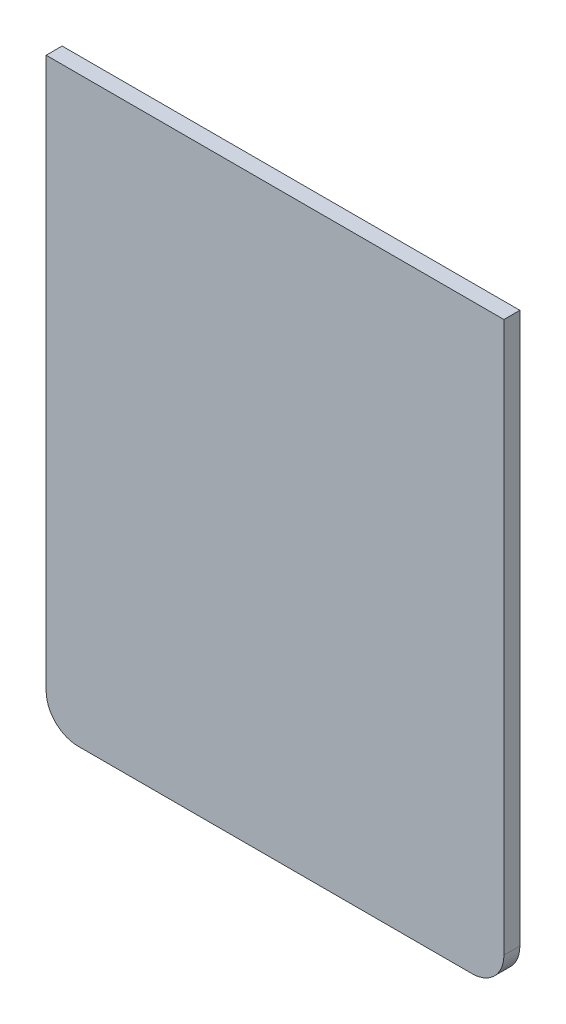
ISO-10303-21;
HEADER;
FILE_DESCRIPTION(('STEP AP214'),'2;1');
FILE_NAME('part.step','',(''),(''),'','','');
FILE_SCHEMA(('AUTOMOTIVE_DESIGN { 1 0 10303 214 1 1 1 1 }'));
ENDSEC;
DATA;
#1=APPLICATION_CONTEXT('core data for automotive mechanical design processes');
#2=APPLICATION_PROTOCOL_DEFINITION('international standard','automotive_design',2000,#1);
#3=PRODUCT_CONTEXT('',#1,'mechanical');
#4=PRODUCT('Part','Part','',(#3));
#5=PRODUCT_RELATED_PRODUCT_CATEGORY('part','',(#4));
#6=PRODUCT_DEFINITION_FORMATION('','',#4);
#7=PRODUCT_DEFINITION_CONTEXT('part definition',#1,'design');
#8=PRODUCT_DEFINITION('design','',#6,#7);
#9=PRODUCT_DEFINITION_SHAPE('','',#8);
#10=(LENGTH_UNIT() NAMED_UNIT(*) SI_UNIT(.MILLI.,.METRE.));
#11=(NAMED_UNIT(*) PLANE_ANGLE_UNIT() SI_UNIT($,.RADIAN.));
#12=(NAMED_UNIT(*) SI_UNIT($,.STERADIAN.) SOLID_ANGLE_UNIT());
#13=UNCERTAINTY_MEASURE_WITH_UNIT(LENGTH_MEASURE(1.E-05),#10,'distance_accuracy_value','');
#14=(GEOMETRIC_REPRESENTATION_CONTEXT(3) GLOBAL_UNCERTAINTY_ASSIGNED_CONTEXT((#13)) GLOBAL_UNIT_ASSIGNED_CONTEXT((#10,
#11,#12)) REPRESENTATION_CONTEXT('',''));
#15=CARTESIAN_POINT('',(0.,0.,0.));
#16=DIRECTION('',(0.,0.,1.));
#17=DIRECTION('',(1.,0.,0.));
#18=AXIS2_PLACEMENT_3D('',#15,#16,#17);
#19=CARTESIAN_POINT('',(163.099999994002,683.952163009712,6.35));
#20=DIRECTION('',(-1.,0.,0.));
#21=DIRECTION('',(0.,-1.,0.));
#22=AXIS2_PLACEMENT_3D('',#19,#20,#21);
#23=PLANE('',#22);
#24=DIRECTION('',(0.,1.,0.));
#25=VECTOR('',#24,1.);
#26=CARTESIAN_POINT('',(163.099999994002,683.952163009712,0.));
#27=LINE('',#26,#25);
#28=CARTESIAN_POINT('',(163.099999994002,683.952163009712,0.));
#29=VERTEX_POINT('',#28);
#30=CARTESIAN_POINT('',(163.099999994006,903.027163009702,0.));
#31=VERTEX_POINT('',#30);
#32=EDGE_CURVE('E119',#29,#31,#27,.T.);
#33=ORIENTED_EDGE('',*,*,#32,.T.);
#34=DIRECTION('',(0.,0.,-1.));
#35=VECTOR('',#34,1.);
#36=CARTESIAN_POINT('',(163.099999994006,903.027163009702,6.35));
#37=LINE('',#36,#35);
#38=CARTESIAN_POINT('',(163.099999994006,903.027163009702,6.35));
#39=VERTEX_POINT('',#38);
#40=EDGE_CURVE('E11',#39,#31,#37,.T.);
#41=ORIENTED_EDGE('',*,*,#40,.F.);
#42=DIRECTION('',(0.,1.,0.));
#43=VECTOR('',#42,1.);
#44=CARTESIAN_POINT('',(163.099999994002,683.952163009712,6.35));
#45=LINE('',#44,#43);
#46=CARTESIAN_POINT('',(163.099999994002,683.952163009712,6.35));
#47=VERTEX_POINT('',#46);
#48=EDGE_CURVE('E129',#47,#39,#45,.T.);
#49=ORIENTED_EDGE('',*,*,#48,.F.);
#50=DIRECTION('',(0.,0.,-1.));
#51=VECTOR('',#50,1.);
#52=CARTESIAN_POINT('',(163.099999994002,683.952163009712,6.35));
#53=LINE('',#52,#51);
#54=EDGE_CURVE('E115',#47,#29,#53,.T.);
#55=ORIENTED_EDGE('',*,*,#54,.T.);
#56=EDGE_LOOP('',(#33,#41,#49,#55));
#57=FACE_BOUND('',#56,.T.);
#58=ADVANCED_FACE('F35',(#57),#23,.F.);
#59=CARTESIAN_POINT('',(-19.0500000000002,903.027163009702,6.35));
#60=DIRECTION('',(0.,-1.,0.));
#61=DIRECTION('',(1.,0.,0.));
#62=AXIS2_PLACEMENT_3D('',#59,#60,#61);
#63=PLANE('',#62);
#64=DIRECTION('',(-1.,0.,0.));
#65=VECTOR('',#64,1.);
#66=CARTESIAN_POINT('',(-19.0500000000002,903.027163009702,0.));
#67=LINE('',#66,#65);
#68=CARTESIAN_POINT('',(-19.0500000000002,903.027163009702,0.));
#69=VERTEX_POINT('',#68);
#70=EDGE_CURVE('E122',#31,#69,#67,.T.);
#71=ORIENTED_EDGE('',*,*,#70,.T.);
#72=DIRECTION('',(0.,0.,-1.));
#73=VECTOR('',#72,1.);
#74=CARTESIAN_POINT('',(-19.0500000000002,903.027163009702,6.35));
#75=LINE('',#74,#73);
#76=CARTESIAN_POINT('',(-19.0500000000002,903.027163009702,6.35));
#77=VERTEX_POINT('',#76);
#78=EDGE_CURVE('E43',#77,#69,#75,.T.);
#79=ORIENTED_EDGE('',*,*,#78,.F.);
#80=DIRECTION('',(-1.,0.,0.));
#81=VECTOR('',#80,1.);
#82=CARTESIAN_POINT('',(-19.0500000000002,903.027163009702,6.35));
#83=LINE('',#82,#81);
#84=EDGE_CURVE('E88',#39,#77,#83,.T.);
#85=ORIENTED_EDGE('',*,*,#84,.F.);
#86=ORIENTED_EDGE('',*,*,#40,.T.);
#87=EDGE_LOOP('',(#71,#79,#85,#86));
#88=FACE_BOUND('',#87,.T.);
#89=ADVANCED_FACE('F153',(#88),#63,.F.);
#90=CARTESIAN_POINT('',(-19.0500000000002,903.027163009702,6.35));
#91=DIRECTION('',(1.,0.,0.));
#92=DIRECTION('',(0.,1.,0.));
#93=AXIS2_PLACEMENT_3D('',#90,#91,#92);
#94=PLANE('',#93);
#95=DIRECTION('',(0.,-1.,0.));
#96=VECTOR('',#95,1.);
#97=CARTESIAN_POINT('',(-19.0500000000002,903.027163009702,0.));
#98=LINE('',#97,#96);
#99=CARTESIAN_POINT('',(-19.0499999999997,683.952163009714,0.));
#100=VERTEX_POINT('',#99);
#101=EDGE_CURVE('E124',#69,#100,#98,.T.);
#102=ORIENTED_EDGE('',*,*,#101,.T.);
#103=DIRECTION('',(0.,0.,-1.));
#104=VECTOR('',#103,1.);
#105=CARTESIAN_POINT('',(-19.0499999999997,683.952163009714,6.35));
#106=LINE('',#105,#104);
#107=CARTESIAN_POINT('',(-19.0499999999997,683.952163009714,6.35));
#108=VERTEX_POINT('',#107);
#109=EDGE_CURVE('E110',#108,#100,#106,.T.);
#110=ORIENTED_EDGE('',*,*,#109,.F.);
#111=DIRECTION('',(0.,-1.,0.));
#112=VECTOR('',#111,1.);
#113=CARTESIAN_POINT('',(-19.0500000000002,903.027163009702,6.35));
#114=LINE('',#113,#112);
#115=EDGE_CURVE('E101',#77,#108,#114,.T.);
#116=ORIENTED_EDGE('',*,*,#115,.F.);
#117=ORIENTED_EDGE('',*,*,#78,.T.);
#118=EDGE_LOOP('',(#102,#110,#116,#117));
#119=FACE_BOUND('',#118,.T.);
#120=ADVANCED_FACE('F135',(#119),#94,.F.);
#121=CARTESIAN_POINT('',(-6.34999999999969,683.952163009714,6.35));
#122=DIRECTION('',(0.,0.,-1.));
#123=DIRECTION('',(-1.,0.,0.));
#124=AXIS2_PLACEMENT_3D('',#121,#122,#123);
#125=CYLINDRICAL_SURFACE('',#124,12.7);
#126=CARTESIAN_POINT('',(-6.34999999999969,683.952163009714,0.));
#127=DIRECTION('',(0.,0.,1.));
#128=DIRECTION('',(1.,0.,0.));
#129=AXIS2_PLACEMENT_3D('',#126,#127,#128);
#130=CIRCLE('',#129,12.7);
#131=CARTESIAN_POINT('',(-6.34999999999988,671.252163009714,0.));
#132=VERTEX_POINT('',#131);
#133=EDGE_CURVE('E109',#100,#132,#130,.T.);
#134=ORIENTED_EDGE('',*,*,#133,.T.);
#135=DIRECTION('',(0.,0.,-1.));
#136=VECTOR('',#135,1.);
#137=CARTESIAN_POINT('',(-6.34999999999988,671.252163009714,6.35));
#138=LINE('',#137,#136);
#139=CARTESIAN_POINT('',(-6.34999999999988,671.252163009714,6.35));
#140=VERTEX_POINT('',#139);
#141=EDGE_CURVE('E106',#140,#132,#138,.T.);
#142=ORIENTED_EDGE('',*,*,#141,.F.);
#143=CARTESIAN_POINT('',(-6.34999999999969,683.952163009714,6.35));
#144=DIRECTION('',(0.,0.,1.));
#145=DIRECTION('',(1.,0.,0.));
#146=AXIS2_PLACEMENT_3D('',#143,#144,#145);
#147=CIRCLE('',#146,12.7);
#148=EDGE_CURVE('E95',#108,#140,#147,.T.);
#149=ORIENTED_EDGE('',*,*,#148,.F.);
#150=ORIENTED_EDGE('',*,*,#109,.T.);
#151=EDGE_LOOP('',(#134,#142,#149,#150));
#152=FACE_BOUND('',#151,.T.);
#153=ADVANCED_FACE('F107',(#152),#125,.T.);
#154=CARTESIAN_POINT('',(-6.34999999999988,671.252163009714,6.35));
#155=DIRECTION('',(0.,1.,0.));
#156=DIRECTION('',(-1.,0.,0.));
#157=AXIS2_PLACEMENT_3D('',#154,#155,#156);
#158=PLANE('',#157);
#159=DIRECTION('',(1.,0.,0.));
#160=VECTOR('',#159,1.);
#161=CARTESIAN_POINT('',(-6.34999999999988,671.252163009714,0.));
#162=LINE('',#161,#160);
#163=CARTESIAN_POINT('',(150.399999994002,671.252163009712,0.));
#164=VERTEX_POINT('',#163);
#165=EDGE_CURVE('E74',#132,#164,#162,.T.);
#166=ORIENTED_EDGE('',*,*,#165,.T.);
#167=DIRECTION('',(0.,0.,-1.));
#168=VECTOR('',#167,1.);
#169=CARTESIAN_POINT('',(150.399999994002,671.252163009712,6.35));
#170=LINE('',#169,#168);
#171=CARTESIAN_POINT('',(150.399999994002,671.252163009712,6.35));
#172=VERTEX_POINT('',#171);
#173=EDGE_CURVE('E111',#172,#164,#170,.T.);
#174=ORIENTED_EDGE('',*,*,#173,.F.);
#175=DIRECTION('',(1.,0.,0.));
#176=VECTOR('',#175,1.);
#177=CARTESIAN_POINT('',(-6.34999999999988,671.252163009714,6.35));
#178=LINE('',#177,#176);
#179=EDGE_CURVE('E99',#140,#172,#178,.T.);
#180=ORIENTED_EDGE('',*,*,#179,.F.);
#181=ORIENTED_EDGE('',*,*,#141,.T.);
#182=EDGE_LOOP('',(#166,#174,#180,#181));
#183=FACE_BOUND('',#182,.T.);
#184=ADVANCED_FACE('F113',(#183),#158,.F.);
#185=CARTESIAN_POINT('',(150.399999994002,683.952163009712,6.35));
#186=DIRECTION('',(0.,0.,-1.));
#187=DIRECTION('',(-1.,0.,0.));
#188=AXIS2_PLACEMENT_3D('',#185,#186,#187);
#189=CYLINDRICAL_SURFACE('',#188,12.7);
#190=CARTESIAN_POINT('',(150.399999994002,683.952163009712,0.));
#191=DIRECTION('',(0.,0.,1.));
#192=DIRECTION('',(1.,0.,0.));
#193=AXIS2_PLACEMENT_3D('',#190,#191,#192);
#194=CIRCLE('',#193,12.7);
#195=EDGE_CURVE('E80',#164,#29,#194,.T.);
#196=ORIENTED_EDGE('',*,*,#195,.T.);
#197=ORIENTED_EDGE('',*,*,#54,.F.);
#198=CARTESIAN_POINT('',(150.399999994002,683.952163009712,6.35));
#199=DIRECTION('',(0.,0.,1.));
#200=DIRECTION('',(1.,0.,0.));
#201=AXIS2_PLACEMENT_3D('',#198,#199,#200);
#202=CIRCLE('',#201,12.7);
#203=EDGE_CURVE('E51',#172,#47,#202,.T.);
#204=ORIENTED_EDGE('',*,*,#203,.F.);
#205=ORIENTED_EDGE('',*,*,#173,.T.);
#206=EDGE_LOOP('',(#196,#197,#204,#205));
#207=FACE_BOUND('',#206,.T.);
#208=ADVANCED_FACE('F142',(#207),#189,.T.);
#209=CARTESIAN_POINT('',(-6.34999999999969,683.952163009714,6.35));
#210=DIRECTION('',(0.,0.,1.));
#211=DIRECTION('',(1.,0.,0.));
#212=AXIS2_PLACEMENT_3D('',#209,#210,#211);
#213=PLANE('',#212);
#214=ORIENTED_EDGE('',*,*,#48,.T.);
#215=ORIENTED_EDGE('',*,*,#84,.T.);
#216=ORIENTED_EDGE('',*,*,#115,.T.);
#217=ORIENTED_EDGE('',*,*,#148,.T.);
#218=ORIENTED_EDGE('',*,*,#179,.T.);
#219=ORIENTED_EDGE('',*,*,#203,.T.);
#220=EDGE_LOOP('',(#214,#215,#216,#217,#218,#219));
#221=FACE_BOUND('',#220,.T.);
#222=ADVANCED_FACE('F97',(#221),#213,.T.);
#223=CARTESIAN_POINT('',(-6.34999999999969,683.952163009714,0.));
#224=DIRECTION('',(0.,0.,1.));
#225=DIRECTION('',(1.,0.,0.));
#226=AXIS2_PLACEMENT_3D('',#223,#224,#225);
#227=PLANE('',#226);
#228=ORIENTED_EDGE('',*,*,#32,.F.);
#229=ORIENTED_EDGE('',*,*,#195,.F.);
#230=ORIENTED_EDGE('',*,*,#165,.F.);
#231=ORIENTED_EDGE('',*,*,#133,.F.);
#232=ORIENTED_EDGE('',*,*,#101,.F.);
#233=ORIENTED_EDGE('',*,*,#70,.F.);
#234=EDGE_LOOP('',(#228,#229,#230,#231,#232,#233));
#235=FACE_BOUND('',#234,.T.);
#236=ADVANCED_FACE('F138',(#235),#227,.F.);
#237=CLOSED_SHELL('',(#58,#89,#120,#153,#184,#208,#222,#236));
#238=MANIFOLD_SOLID_BREP('B2',#237);
#239=ADVANCED_BREP_SHAPE_REPRESENTATION('',(#18,#238),#14);
#240=SHAPE_DEFINITION_REPRESENTATION(#9,#239);
ENDSEC;
END-ISO-10303-21;
